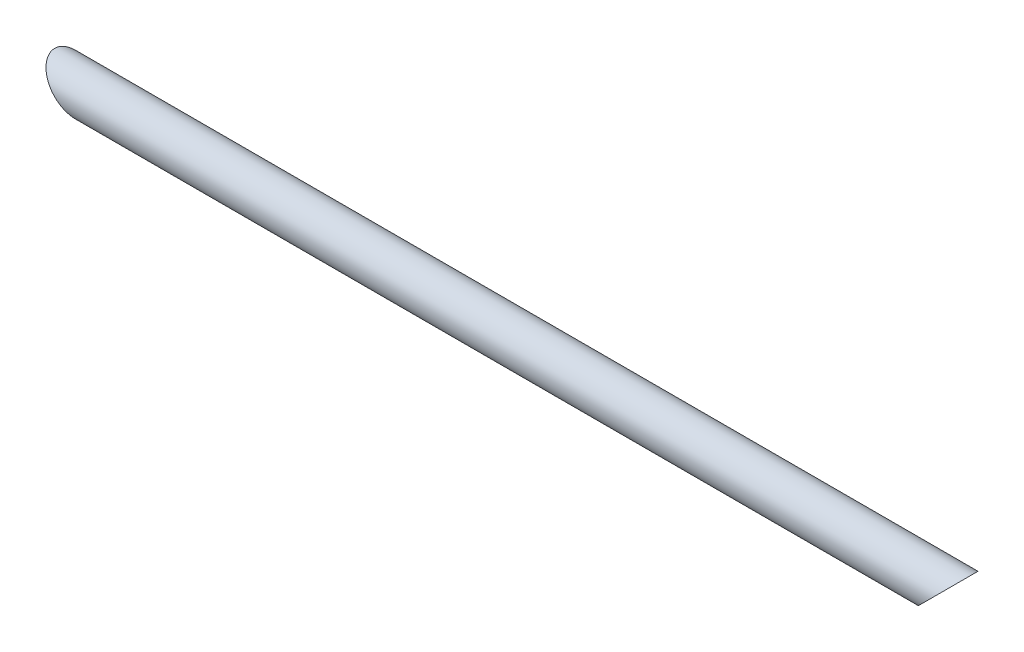
ISO-10303-21;
HEADER;
FILE_DESCRIPTION(('STEP AP214'),'2;1');
FILE_NAME('part.step','',(''),(''),'','','');
FILE_SCHEMA(('AUTOMOTIVE_DESIGN { 1 0 10303 214 1 1 1 1 }'));
ENDSEC;
DATA;
#1=APPLICATION_CONTEXT('core data for automotive mechanical design processes');
#2=APPLICATION_PROTOCOL_DEFINITION('international standard','automotive_design',2000,#1);
#3=PRODUCT_CONTEXT('',#1,'mechanical');
#4=PRODUCT('Part','Part','',(#3));
#5=PRODUCT_RELATED_PRODUCT_CATEGORY('part','',(#4));
#6=PRODUCT_DEFINITION_FORMATION('','',#4);
#7=PRODUCT_DEFINITION_CONTEXT('part definition',#1,'design');
#8=PRODUCT_DEFINITION('design','',#6,#7);
#9=PRODUCT_DEFINITION_SHAPE('','',#8);
#10=(LENGTH_UNIT() NAMED_UNIT(*) SI_UNIT(.MILLI.,.METRE.));
#11=(NAMED_UNIT(*) PLANE_ANGLE_UNIT() SI_UNIT($,.RADIAN.));
#12=(NAMED_UNIT(*) SI_UNIT($,.STERADIAN.) SOLID_ANGLE_UNIT());
#13=UNCERTAINTY_MEASURE_WITH_UNIT(LENGTH_MEASURE(1.E-05),#10,'distance_accuracy_value','');
#14=(GEOMETRIC_REPRESENTATION_CONTEXT(3) GLOBAL_UNCERTAINTY_ASSIGNED_CONTEXT((#13)) GLOBAL_UNIT_ASSIGNED_CONTEXT((#10,
#11,#12)) REPRESENTATION_CONTEXT('',''));
#15=CARTESIAN_POINT('',(0.,0.,0.));
#16=DIRECTION('',(0.,0.,1.));
#17=DIRECTION('',(1.,0.,0.));
#18=AXIS2_PLACEMENT_3D('',#15,#16,#17);
#19=CARTESIAN_POINT('',(275.4,0.,0.));
#20=DIRECTION('',(-1.,0.,0.));
#21=DIRECTION('',(0.,0.,1.));
#22=AXIS2_PLACEMENT_3D('',#19,#20,#21);
#23=CYLINDRICAL_SURFACE('',#22,12.7);
#24=CARTESIAN_POINT('',(262.7,0.,0.));
#25=DIRECTION('',(-0.707106781186548,0.707106781186547,0.));
#26=DIRECTION('',(-0.707106781186547,-0.707106781186548,0.));
#27=AXIS2_PLACEMENT_3D('',#24,#25,#26);
#28=ELLIPSE('',#27,17.9605122421383,12.7);
#29=CARTESIAN_POINT('',(250.,-12.7,0.));
#30=VERTEX_POINT('',#29);
#31=EDGE_CURVE('E50',#30,#30,#28,.T.);
#32=ORIENTED_EDGE('',*,*,#31,.T.);
#33=EDGE_LOOP('',(#32));
#34=FACE_BOUND('',#33,.T.);
#35=CARTESIAN_POINT('',(-262.7,0.,0.));
#36=DIRECTION('',(-0.707106781186544,-0.707106781186551,0.));
#37=DIRECTION('',(-0.707106781186551,0.707106781186544,0.));
#38=AXIS2_PLACEMENT_3D('',#35,#36,#37);
#39=ELLIPSE('',#38,17.9605122421384,12.7);
#40=CARTESIAN_POINT('',(-275.4,12.7,0.));
#41=VERTEX_POINT('',#40);
#42=EDGE_CURVE('E12',#41,#41,#39,.T.);
#43=ORIENTED_EDGE('',*,*,#42,.F.);
#44=EDGE_LOOP('',(#43));
#45=FACE_BOUND('',#44,.T.);
#46=ADVANCED_FACE('F38',(#34,#45),#23,.T.);
#47=CARTESIAN_POINT('',(275.4,0.,0.));
#48=DIRECTION('',(-1.,0.,0.));
#49=DIRECTION('',(0.,0.,1.));
#50=AXIS2_PLACEMENT_3D('',#47,#48,#49);
#51=CYLINDRICAL_SURFACE('',#50,11.7);
#52=CARTESIAN_POINT('',(262.7,0.,0.));
#53=DIRECTION('',(-0.707106781186548,0.707106781186547,0.));
#54=DIRECTION('',(-0.707106781186547,-0.707106781186548,0.));
#55=AXIS2_PLACEMENT_3D('',#52,#53,#54);
#56=ELLIPSE('',#55,16.5462986797652,11.7);
#57=CARTESIAN_POINT('',(251.,-11.7,0.));
#58=VERTEX_POINT('',#57);
#59=EDGE_CURVE('E45',#58,#58,#56,.T.);
#60=ORIENTED_EDGE('',*,*,#59,.F.);
#61=EDGE_LOOP('',(#60));
#62=FACE_BOUND('',#61,.T.);
#63=CARTESIAN_POINT('',(-262.7,0.,0.));
#64=DIRECTION('',(-0.707106781186544,-0.707106781186551,0.));
#65=DIRECTION('',(-0.707106781186551,0.707106781186544,0.));
#66=AXIS2_PLACEMENT_3D('',#63,#64,#65);
#67=ELLIPSE('',#66,16.5462986797653,11.7);
#68=CARTESIAN_POINT('',(-274.4,11.7,0.));
#69=VERTEX_POINT('',#68);
#70=EDGE_CURVE('E41',#69,#69,#67,.T.);
#71=ORIENTED_EDGE('',*,*,#70,.T.);
#72=EDGE_LOOP('',(#71));
#73=FACE_BOUND('',#72,.T.);
#74=ADVANCED_FACE('F58',(#62,#73),#51,.F.);
#75=CARTESIAN_POINT('',(131.35,-131.35,0.));
#76=DIRECTION('',(-0.707106781186548,0.707106781186547,0.));
#77=DIRECTION('',(-0.707106781186547,-0.707106781186548,0.));
#78=AXIS2_PLACEMENT_3D('',#75,#76,#77);
#79=PLANE('',#78);
#80=ORIENTED_EDGE('',*,*,#59,.T.);
#81=EDGE_LOOP('',(#80));
#82=FACE_BOUND('',#81,.T.);
#83=ORIENTED_EDGE('',*,*,#31,.F.);
#84=EDGE_LOOP('',(#83));
#85=FACE_BOUND('',#84,.T.);
#86=ADVANCED_FACE('F62',(#82,#85),#79,.F.);
#87=CARTESIAN_POINT('',(-131.349999999998,-131.35,0.));
#88=DIRECTION('',(-0.707106781186544,-0.707106781186551,0.));
#89=DIRECTION('',(0.707106781186551,-0.707106781186544,0.));
#90=AXIS2_PLACEMENT_3D('',#87,#88,#89);
#91=PLANE('',#90);
#92=ORIENTED_EDGE('',*,*,#70,.F.);
#93=EDGE_LOOP('',(#92));
#94=FACE_BOUND('',#93,.T.);
#95=ORIENTED_EDGE('',*,*,#42,.T.);
#96=EDGE_LOOP('',(#95));
#97=FACE_BOUND('',#96,.T.);
#98=ADVANCED_FACE('F60',(#94,#97),#91,.T.);
#99=CLOSED_SHELL('',(#46,#74,#86,#98));
#100=MANIFOLD_SOLID_BREP('B2',#99);
#101=ADVANCED_BREP_SHAPE_REPRESENTATION('',(#18,#100),#14);
#102=SHAPE_DEFINITION_REPRESENTATION(#9,#101);
ENDSEC;
END-ISO-10303-21;
